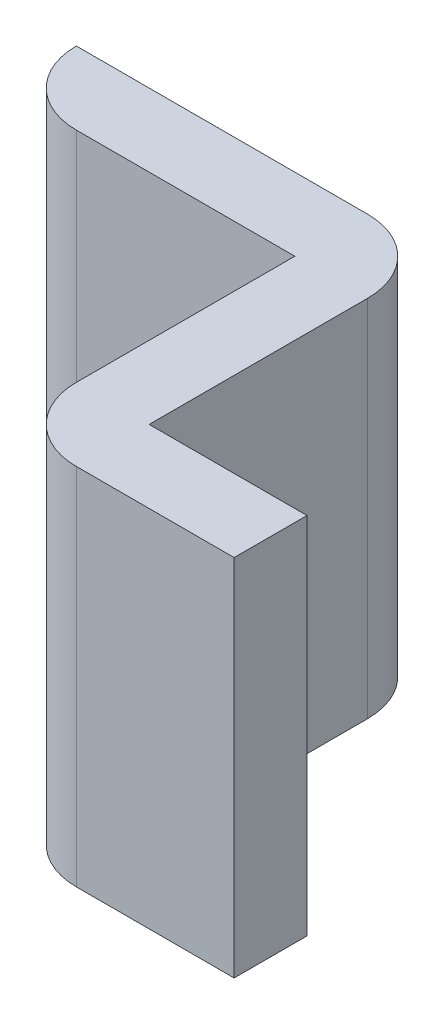
ISO-10303-21;
HEADER;
FILE_DESCRIPTION(('STEP AP214'),'2;1');
FILE_NAME('part.step','',(''),(''),'','','');
FILE_SCHEMA(('AUTOMOTIVE_DESIGN { 1 0 10303 214 1 1 1 1 }'));
ENDSEC;
DATA;
#1=APPLICATION_CONTEXT('core data for automotive mechanical design processes');
#2=APPLICATION_PROTOCOL_DEFINITION('international standard','automotive_design',2000,#1);
#3=PRODUCT_CONTEXT('',#1,'mechanical');
#4=PRODUCT('Part','Part','',(#3));
#5=PRODUCT_RELATED_PRODUCT_CATEGORY('part','',(#4));
#6=PRODUCT_DEFINITION_FORMATION('','',#4);
#7=PRODUCT_DEFINITION_CONTEXT('part definition',#1,'design');
#8=PRODUCT_DEFINITION('design','',#6,#7);
#9=PRODUCT_DEFINITION_SHAPE('','',#8);
#10=(LENGTH_UNIT() NAMED_UNIT(*) SI_UNIT(.MILLI.,.METRE.));
#11=(NAMED_UNIT(*) PLANE_ANGLE_UNIT() SI_UNIT($,.RADIAN.));
#12=(NAMED_UNIT(*) SI_UNIT($,.STERADIAN.) SOLID_ANGLE_UNIT());
#13=UNCERTAINTY_MEASURE_WITH_UNIT(LENGTH_MEASURE(1.E-05),#10,'distance_accuracy_value','');
#14=(GEOMETRIC_REPRESENTATION_CONTEXT(3) GLOBAL_UNCERTAINTY_ASSIGNED_CONTEXT((#13)) GLOBAL_UNIT_ASSIGNED_CONTEXT((#10,
#11,#12)) REPRESENTATION_CONTEXT('',''));
#15=CARTESIAN_POINT('',(0.,0.,0.));
#16=DIRECTION('',(0.,0.,1.));
#17=DIRECTION('',(1.,0.,0.));
#18=AXIS2_PLACEMENT_3D('',#15,#16,#17);
#19=CARTESIAN_POINT('',(-0.5969,-2.0955,0.3048));
#20=DIRECTION('',(-1.,0.,0.));
#21=DIRECTION('',(0.,0.,1.));
#22=AXIS2_PLACEMENT_3D('',#19,#20,#21);
#23=PLANE('',#22);
#24=DIRECTION('',(0.,-1.,0.));
#25=VECTOR('',#24,1.);
#26=CARTESIAN_POINT('',(-0.5969,-2.0955,0.0762));
#27=LINE('',#26,#25);
#28=CARTESIAN_POINT('',(-0.5969,-1.7145,0.0762));
#29=VERTEX_POINT('',#28);
#30=CARTESIAN_POINT('',(-0.5969,-2.0955,0.0762));
#31=VERTEX_POINT('',#30);
#32=EDGE_CURVE('E82',#29,#31,#27,.T.);
#33=ORIENTED_EDGE('',*,*,#32,.F.);
#34=DIRECTION('',(0.,0.,-1.));
#35=VECTOR('',#34,1.);
#36=CARTESIAN_POINT('',(-0.5969,-1.7145,0.));
#37=LINE('',#36,#35);
#38=CARTESIAN_POINT('',(-0.5969,-1.7145,0.3048));
#39=VERTEX_POINT('',#38);
#40=EDGE_CURVE('E79',#29,#39,#37,.F.);
#41=ORIENTED_EDGE('',*,*,#40,.T.);
#42=DIRECTION('',(0.,1.,0.));
#43=VECTOR('',#42,1.);
#44=CARTESIAN_POINT('',(-0.5969,-2.0955,0.3048));
#45=LINE('',#44,#43);
#46=CARTESIAN_POINT('',(-0.5969,-2.0955,0.3048));
#47=VERTEX_POINT('',#46);
#48=EDGE_CURVE('E147',#39,#47,#45,.F.);
#49=ORIENTED_EDGE('',*,*,#48,.T.);
#50=DIRECTION('',(0.,0.,-1.));
#51=VECTOR('',#50,1.);
#52=CARTESIAN_POINT('',(-0.5969,-2.0955,0.));
#53=LINE('',#52,#51);
#54=EDGE_CURVE('E152',#31,#47,#53,.F.);
#55=ORIENTED_EDGE('',*,*,#54,.F.);
#56=EDGE_LOOP('',(#33,#41,#49,#55));
#57=FACE_BOUND('',#56,.T.);
#58=ADVANCED_FACE('F16',(#57),#23,.F.);
#59=CARTESIAN_POINT('',(-0.4318,-2.0955,0.3048));
#60=DIRECTION('',(0.,0.,1.));
#61=DIRECTION('',(1.,0.,0.));
#62=AXIS2_PLACEMENT_3D('',#59,#60,#61);
#63=PLANE('',#62);
#64=ORIENTED_EDGE('',*,*,#48,.F.);
#65=DIRECTION('',(1.,0.,0.));
#66=VECTOR('',#65,1.);
#67=CARTESIAN_POINT('',(-0.9779,-1.7145,0.3048));
#68=LINE('',#67,#66);
#69=CARTESIAN_POINT('',(-0.4318,-1.7145,0.3048));
#70=VERTEX_POINT('',#69);
#71=EDGE_CURVE('E117',#39,#70,#68,.T.);
#72=ORIENTED_EDGE('',*,*,#71,.T.);
#73=DIRECTION('',(0.,1.,0.));
#74=VECTOR('',#73,1.);
#75=CARTESIAN_POINT('',(-0.4318,-2.0955,0.3048));
#76=LINE('',#75,#74);
#77=CARTESIAN_POINT('',(-0.4318,-2.0955,0.3048));
#78=VERTEX_POINT('',#77);
#79=EDGE_CURVE('E135',#70,#78,#76,.F.);
#80=ORIENTED_EDGE('',*,*,#79,.T.);
#81=DIRECTION('',(1.,0.,0.));
#82=VECTOR('',#81,1.);
#83=CARTESIAN_POINT('',(-0.9779,-2.0955,0.3048));
#84=LINE('',#83,#82);
#85=EDGE_CURVE('E142',#47,#78,#84,.T.);
#86=ORIENTED_EDGE('',*,*,#85,.F.);
#87=EDGE_LOOP('',(#64,#72,#80,#86));
#88=FACE_BOUND('',#87,.T.);
#89=ADVANCED_FACE('F314',(#88),#63,.F.);
#90=CARTESIAN_POINT('',(-0.4318,-2.0955,0.381));
#91=DIRECTION('',(-1.,0.,0.));
#92=DIRECTION('',(0.,0.,1.));
#93=AXIS2_PLACEMENT_3D('',#90,#91,#92);
#94=PLANE('',#93);
#95=ORIENTED_EDGE('',*,*,#79,.F.);
#96=DIRECTION('',(0.,0.,-1.));
#97=VECTOR('',#96,1.);
#98=CARTESIAN_POINT('',(-0.4318,-1.7145,0.));
#99=LINE('',#98,#97);
#100=CARTESIAN_POINT('',(-0.4318,-1.7145,0.381));
#101=VERTEX_POINT('',#100);
#102=EDGE_CURVE('E113',#70,#101,#99,.F.);
#103=ORIENTED_EDGE('',*,*,#102,.T.);
#104=DIRECTION('',(0.,1.,0.));
#105=VECTOR('',#104,1.);
#106=CARTESIAN_POINT('',(-0.4318,-2.0955,0.381));
#107=LINE('',#106,#105);
#108=CARTESIAN_POINT('',(-0.4318,-2.0955,0.381));
#109=VERTEX_POINT('',#108);
#110=EDGE_CURVE('E132',#101,#109,#107,.F.);
#111=ORIENTED_EDGE('',*,*,#110,.T.);
#112=DIRECTION('',(0.,0.,-1.));
#113=VECTOR('',#112,1.);
#114=CARTESIAN_POINT('',(-0.4318,-2.0955,0.));
#115=LINE('',#114,#113);
#116=EDGE_CURVE('E138',#78,#109,#115,.F.);
#117=ORIENTED_EDGE('',*,*,#116,.F.);
#118=EDGE_LOOP('',(#95,#103,#111,#117));
#119=FACE_BOUND('',#118,.T.);
#120=ADVANCED_FACE('F191',(#119),#94,.F.);
#121=CARTESIAN_POINT('',(-0.5969,-2.0955,0.381));
#122=DIRECTION('',(0.,0.,-1.));
#123=DIRECTION('',(-1.,0.,0.));
#124=AXIS2_PLACEMENT_3D('',#121,#122,#123);
#125=PLANE('',#124);
#126=ORIENTED_EDGE('',*,*,#110,.F.);
#127=DIRECTION('',(1.,0.,0.));
#128=VECTOR('',#127,1.);
#129=CARTESIAN_POINT('',(-0.9779,-1.7145,0.381));
#130=LINE('',#129,#128);
#131=CARTESIAN_POINT('',(-0.5969,-1.7145,0.381));
#132=VERTEX_POINT('',#131);
#133=EDGE_CURVE('E110',#101,#132,#130,.F.);
#134=ORIENTED_EDGE('',*,*,#133,.T.);
#135=DIRECTION('',(0.,-1.,0.));
#136=VECTOR('',#135,1.);
#137=CARTESIAN_POINT('',(-0.5969,-2.0955,0.381));
#138=LINE('',#137,#136);
#139=CARTESIAN_POINT('',(-0.5969,-2.0955,0.381));
#140=VERTEX_POINT('',#139);
#141=EDGE_CURVE('E130',#140,#132,#138,.F.);
#142=ORIENTED_EDGE('',*,*,#141,.F.);
#143=DIRECTION('',(1.,0.,0.));
#144=VECTOR('',#143,1.);
#145=CARTESIAN_POINT('',(-0.9779,-2.0955,0.381));
#146=LINE('',#145,#144);
#147=EDGE_CURVE('E141',#109,#140,#146,.F.);
#148=ORIENTED_EDGE('',*,*,#147,.F.);
#149=EDGE_LOOP('',(#126,#134,#142,#148));
#150=FACE_BOUND('',#149,.T.);
#151=ADVANCED_FACE('F184',(#150),#125,.F.);
#152=CARTESIAN_POINT('',(-0.5969,-2.0955,0.3048));
#153=DIRECTION('',(0.,-1.,0.));
#154=DIRECTION('',(0.,0.,-1.));
#155=AXIS2_PLACEMENT_3D('',#152,#153,#154);
#156=CYLINDRICAL_SURFACE('',#155,0.0762);
#157=CARTESIAN_POINT('',(-0.5969,-1.7145,0.3048));
#158=DIRECTION('',(0.,-1.,0.));
#159=DIRECTION('',(0.,0.,-1.));
#160=AXIS2_PLACEMENT_3D('',#157,#158,#159);
#161=CIRCLE('',#160,0.0762);
#162=CARTESIAN_POINT('',(-0.6731,-1.7145,0.3048));
#163=VERTEX_POINT('',#162);
#164=EDGE_CURVE('E107',#132,#163,#161,.T.);
#165=ORIENTED_EDGE('',*,*,#164,.T.);
#166=DIRECTION('',(0.,1.,0.));
#167=VECTOR('',#166,1.);
#168=CARTESIAN_POINT('',(-0.6731,-2.0955,0.3048));
#169=LINE('',#168,#167);
#170=CARTESIAN_POINT('',(-0.6731,-2.0955,0.3048));
#171=VERTEX_POINT('',#170);
#172=EDGE_CURVE('E125',#163,#171,#169,.F.);
#173=ORIENTED_EDGE('',*,*,#172,.T.);
#174=CARTESIAN_POINT('',(-0.5969,-2.0955,0.3048));
#175=DIRECTION('',(0.,-1.,0.));
#176=DIRECTION('',(0.,0.,-1.));
#177=AXIS2_PLACEMENT_3D('',#174,#175,#176);
#178=CIRCLE('',#177,0.0762);
#179=EDGE_CURVE('E168',#140,#171,#178,.T.);
#180=ORIENTED_EDGE('',*,*,#179,.F.);
#181=ORIENTED_EDGE('',*,*,#141,.T.);
#182=EDGE_LOOP('',(#165,#173,#180,#181));
#183=FACE_BOUND('',#182,.T.);
#184=ADVANCED_FACE('F175',(#183),#156,.T.);
#185=CARTESIAN_POINT('',(-0.6731,-2.0955,0.0762));
#186=DIRECTION('',(1.,0.,0.));
#187=DIRECTION('',(0.,0.,-1.));
#188=AXIS2_PLACEMENT_3D('',#185,#186,#187);
#189=PLANE('',#188);
#190=ORIENTED_EDGE('',*,*,#172,.F.);
#191=DIRECTION('',(0.,0.,-1.));
#192=VECTOR('',#191,1.);
#193=CARTESIAN_POINT('',(-0.6731,-1.7145,0.));
#194=LINE('',#193,#192);
#195=CARTESIAN_POINT('',(-0.6731,-1.7145,0.0762));
#196=VERTEX_POINT('',#195);
#197=EDGE_CURVE('E102',#163,#196,#194,.T.);
#198=ORIENTED_EDGE('',*,*,#197,.T.);
#199=DIRECTION('',(0.,1.,0.));
#200=VECTOR('',#199,1.);
#201=CARTESIAN_POINT('',(-0.6731,-2.0955,0.0762));
#202=LINE('',#201,#200);
#203=CARTESIAN_POINT('',(-0.6731,-2.0955,0.0762));
#204=VERTEX_POINT('',#203);
#205=EDGE_CURVE('E122',#196,#204,#202,.F.);
#206=ORIENTED_EDGE('',*,*,#205,.T.);
#207=DIRECTION('',(0.,0.,-1.));
#208=VECTOR('',#207,1.);
#209=CARTESIAN_POINT('',(-0.6731,-2.0955,0.));
#210=LINE('',#209,#208);
#211=EDGE_CURVE('E170',#171,#204,#210,.T.);
#212=ORIENTED_EDGE('',*,*,#211,.F.);
#213=EDGE_LOOP('',(#190,#198,#206,#212));
#214=FACE_BOUND('',#213,.T.);
#215=ADVANCED_FACE('F229',(#214),#189,.F.);
#216=CARTESIAN_POINT('',(-0.9017,-2.0955,0.0762));
#217=DIRECTION('',(0.,0.,-1.));
#218=DIRECTION('',(-1.,0.,0.));
#219=AXIS2_PLACEMENT_3D('',#216,#217,#218);
#220=PLANE('',#219);
#221=ORIENTED_EDGE('',*,*,#205,.F.);
#222=DIRECTION('',(1.,0.,0.));
#223=VECTOR('',#222,1.);
#224=CARTESIAN_POINT('',(-0.9779,-1.7145,0.0762));
#225=LINE('',#224,#223);
#226=CARTESIAN_POINT('',(-0.9017,-1.7145,0.0762));
#227=VERTEX_POINT('',#226);
#228=EDGE_CURVE('E98',#196,#227,#225,.F.);
#229=ORIENTED_EDGE('',*,*,#228,.T.);
#230=DIRECTION('',(0.,-1.,0.));
#231=VECTOR('',#230,1.);
#232=CARTESIAN_POINT('',(-0.9017,-2.0955,0.0762));
#233=LINE('',#232,#231);
#234=CARTESIAN_POINT('',(-0.9017,-2.0955,0.0762));
#235=VERTEX_POINT('',#234);
#236=EDGE_CURVE('E101',#235,#227,#233,.F.);
#237=ORIENTED_EDGE('',*,*,#236,.F.);
#238=DIRECTION('',(1.,0.,0.));
#239=VECTOR('',#238,1.);
#240=CARTESIAN_POINT('',(-0.9779,-2.0955,0.0762));
#241=LINE('',#240,#239);
#242=EDGE_CURVE('E94',#204,#235,#241,.F.);
#243=ORIENTED_EDGE('',*,*,#242,.F.);
#244=EDGE_LOOP('',(#221,#229,#237,#243));
#245=FACE_BOUND('',#244,.T.);
#246=ADVANCED_FACE('F227',(#245),#220,.F.);
#247=CARTESIAN_POINT('',(-0.6731,-2.0955,0.0762));
#248=DIRECTION('',(0.,-1.,0.));
#249=DIRECTION('',(0.,0.,-1.));
#250=AXIS2_PLACEMENT_3D('',#247,#248,#249);
#251=CYLINDRICAL_SURFACE('',#250,0.0762);
#252=CARTESIAN_POINT('',(-0.6731,-1.7145,0.0762));
#253=DIRECTION('',(0.,-1.,0.));
#254=DIRECTION('',(0.,0.,-1.));
#255=AXIS2_PLACEMENT_3D('',#252,#253,#254);
#256=CIRCLE('',#255,0.0762);
#257=CARTESIAN_POINT('',(-0.6731,-1.7145,0.));
#258=VERTEX_POINT('',#257);
#259=EDGE_CURVE('E19',#258,#29,#256,.T.);
#260=ORIENTED_EDGE('',*,*,#259,.T.);
#261=ORIENTED_EDGE('',*,*,#32,.T.);
#262=CARTESIAN_POINT('',(-0.6731,-2.0955,0.0762));
#263=DIRECTION('',(0.,-1.,0.));
#264=DIRECTION('',(0.,0.,-1.));
#265=AXIS2_PLACEMENT_3D('',#262,#263,#264);
#266=CIRCLE('',#265,0.0762);
#267=CARTESIAN_POINT('',(-0.6731,-2.0955,0.));
#268=VERTEX_POINT('',#267);
#269=EDGE_CURVE('E92',#268,#31,#266,.T.);
#270=ORIENTED_EDGE('',*,*,#269,.F.);
#271=DIRECTION('',(0.,1.,0.));
#272=VECTOR('',#271,1.);
#273=CARTESIAN_POINT('',(-0.6731,-2.0955,0.));
#274=LINE('',#273,#272);
#275=EDGE_CURVE('E86',#268,#258,#274,.T.);
#276=ORIENTED_EDGE('',*,*,#275,.T.);
#277=EDGE_LOOP('',(#260,#261,#270,#276));
#278=FACE_BOUND('',#277,.T.);
#279=ADVANCED_FACE('F90',(#278),#251,.T.);
#280=CARTESIAN_POINT('',(-0.9779,-1.7145,0.));
#281=DIRECTION('',(0.,-1.,0.));
#282=DIRECTION('',(0.,0.,-1.));
#283=AXIS2_PLACEMENT_3D('',#280,#281,#282);
#284=PLANE('',#283);
#285=ORIENTED_EDGE('',*,*,#228,.F.);
#286=ORIENTED_EDGE('',*,*,#197,.F.);
#287=ORIENTED_EDGE('',*,*,#164,.F.);
#288=ORIENTED_EDGE('',*,*,#133,.F.);
#289=ORIENTED_EDGE('',*,*,#102,.F.);
#290=ORIENTED_EDGE('',*,*,#71,.F.);
#291=ORIENTED_EDGE('',*,*,#40,.F.);
#292=ORIENTED_EDGE('',*,*,#259,.F.);
#293=DIRECTION('',(1.,0.,0.));
#294=VECTOR('',#293,1.);
#295=CARTESIAN_POINT('',(-0.6731,-1.7145,0.));
#296=LINE('',#295,#294);
#297=CARTESIAN_POINT('',(-0.9779,-1.7145,0.));
#298=VERTEX_POINT('',#297);
#299=EDGE_CURVE('E76',#258,#298,#296,.F.);
#300=ORIENTED_EDGE('',*,*,#299,.T.);
#301=CARTESIAN_POINT('',(-0.9017,-1.7145,0.));
#302=DIRECTION('',(0.,-1.,0.));
#303=DIRECTION('',(0.,0.,-1.));
#304=AXIS2_PLACEMENT_3D('',#301,#302,#303);
#305=CIRCLE('',#304,0.0762);
#306=EDGE_CURVE('E121',#227,#298,#305,.T.);
#307=ORIENTED_EDGE('',*,*,#306,.F.);
#308=EDGE_LOOP('',(#285,#286,#287,#288,#289,#290,#291,#292,#300,#307));
#309=FACE_BOUND('',#308,.T.);
#310=ADVANCED_FACE('F74',(#309),#284,.F.);
#311=CARTESIAN_POINT('',(-0.9017,-2.0955,0.));
#312=DIRECTION('',(0.,-1.,0.));
#313=DIRECTION('',(0.,0.,-1.));
#314=AXIS2_PLACEMENT_3D('',#311,#312,#313);
#315=CYLINDRICAL_SURFACE('',#314,0.0762);
#316=ORIENTED_EDGE('',*,*,#306,.T.);
#317=DIRECTION('',(0.,1.,0.));
#318=VECTOR('',#317,1.);
#319=CARTESIAN_POINT('',(-0.9779,-2.0955,0.));
#320=LINE('',#319,#318);
#321=CARTESIAN_POINT('',(-0.9779,-2.0955,0.));
#322=VERTEX_POINT('',#321);
#323=EDGE_CURVE('E25',#298,#322,#320,.F.);
#324=ORIENTED_EDGE('',*,*,#323,.T.);
#325=CARTESIAN_POINT('',(-0.9017,-2.0955,0.));
#326=DIRECTION('',(0.,-1.,0.));
#327=DIRECTION('',(0.,0.,-1.));
#328=AXIS2_PLACEMENT_3D('',#325,#326,#327);
#329=CIRCLE('',#328,0.0762);
#330=EDGE_CURVE('E33',#235,#322,#329,.T.);
#331=ORIENTED_EDGE('',*,*,#330,.F.);
#332=ORIENTED_EDGE('',*,*,#236,.T.);
#333=EDGE_LOOP('',(#316,#324,#331,#332));
#334=FACE_BOUND('',#333,.T.);
#335=ADVANCED_FACE('F209',(#334),#315,.T.);
#336=CARTESIAN_POINT('',(-0.9779,-2.0955,0.));
#337=DIRECTION('',(0.,-1.,0.));
#338=DIRECTION('',(0.,0.,-1.));
#339=AXIS2_PLACEMENT_3D('',#336,#337,#338);
#340=PLANE('',#339);
#341=ORIENTED_EDGE('',*,*,#242,.T.);
#342=ORIENTED_EDGE('',*,*,#330,.T.);
#343=DIRECTION('',(1.,0.,0.));
#344=VECTOR('',#343,1.);
#345=CARTESIAN_POINT('',(-0.6731,-2.0955,0.));
#346=LINE('',#345,#344);
#347=EDGE_CURVE('E11',#322,#268,#346,.T.);
#348=ORIENTED_EDGE('',*,*,#347,.T.);
#349=ORIENTED_EDGE('',*,*,#269,.T.);
#350=ORIENTED_EDGE('',*,*,#54,.T.);
#351=ORIENTED_EDGE('',*,*,#85,.T.);
#352=ORIENTED_EDGE('',*,*,#116,.T.);
#353=ORIENTED_EDGE('',*,*,#147,.T.);
#354=ORIENTED_EDGE('',*,*,#179,.T.);
#355=ORIENTED_EDGE('',*,*,#211,.T.);
#356=EDGE_LOOP('',(#341,#342,#348,#349,#350,#351,#352,#353,#354,#355));
#357=FACE_BOUND('',#356,.T.);
#358=ADVANCED_FACE('F207',(#357),#340,.T.);
#359=CARTESIAN_POINT('',(-0.6731,-2.0955,0.));
#360=DIRECTION('',(0.,0.,1.));
#361=DIRECTION('',(1.,0.,0.));
#362=AXIS2_PLACEMENT_3D('',#359,#360,#361);
#363=PLANE('',#362);
#364=ORIENTED_EDGE('',*,*,#323,.F.);
#365=ORIENTED_EDGE('',*,*,#299,.F.);
#366=ORIENTED_EDGE('',*,*,#275,.F.);
#367=ORIENTED_EDGE('',*,*,#347,.F.);
#368=EDGE_LOOP('',(#364,#365,#366,#367));
#369=FACE_BOUND('',#368,.T.);
#370=ADVANCED_FACE('F85',(#369),#363,.F.);
#371=CLOSED_SHELL('',(#58,#89,#120,#151,#184,#215,#246,#279,#310,#335,#358,#370));
#372=MANIFOLD_SOLID_BREP('B1',#371);
#373=ADVANCED_BREP_SHAPE_REPRESENTATION('',(#18,#372),#14);
#374=SHAPE_DEFINITION_REPRESENTATION(#9,#373);
ENDSEC;
END-ISO-10303-21;
